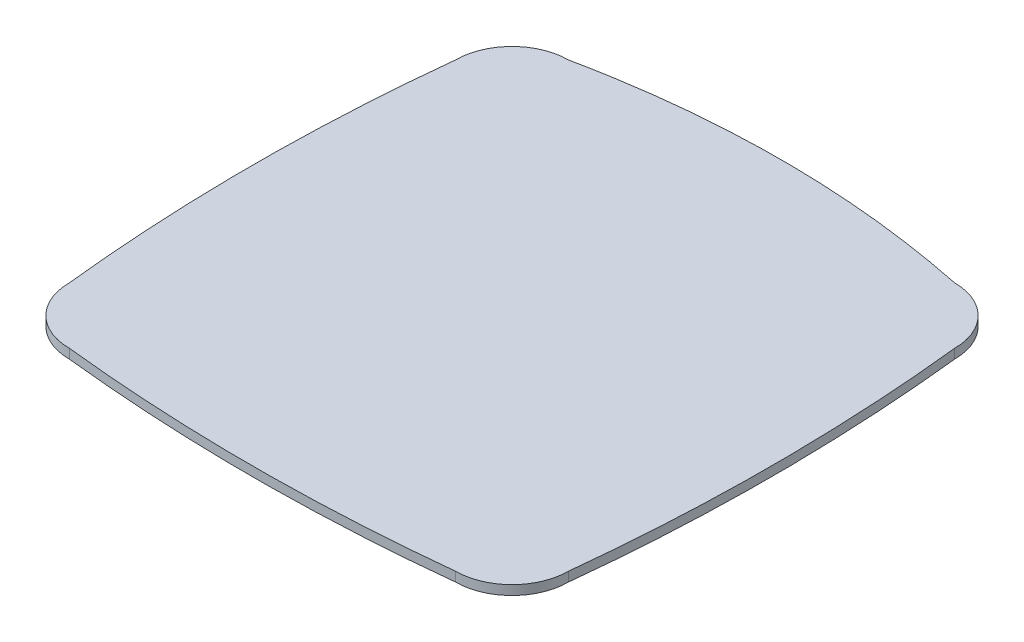
ISO-10303-21;
HEADER;
FILE_DESCRIPTION(('STEP AP214'),'2;1');
FILE_NAME('part.step','',(''),(''),'','','');
FILE_SCHEMA(('AUTOMOTIVE_DESIGN { 1 0 10303 214 1 1 1 1 }'));
ENDSEC;
DATA;
#1=APPLICATION_CONTEXT('core data for automotive mechanical design processes');
#2=APPLICATION_PROTOCOL_DEFINITION('international standard','automotive_design',2000,#1);
#3=PRODUCT_CONTEXT('',#1,'mechanical');
#4=PRODUCT('Part','Part','',(#3));
#5=PRODUCT_RELATED_PRODUCT_CATEGORY('part','',(#4));
#6=PRODUCT_DEFINITION_FORMATION('','',#4);
#7=PRODUCT_DEFINITION_CONTEXT('part definition',#1,'design');
#8=PRODUCT_DEFINITION('design','',#6,#7);
#9=PRODUCT_DEFINITION_SHAPE('','',#8);
#10=(LENGTH_UNIT() NAMED_UNIT(*) SI_UNIT(.MILLI.,.METRE.));
#11=(NAMED_UNIT(*) PLANE_ANGLE_UNIT() SI_UNIT($,.RADIAN.));
#12=(NAMED_UNIT(*) SI_UNIT($,.STERADIAN.) SOLID_ANGLE_UNIT());
#13=UNCERTAINTY_MEASURE_WITH_UNIT(LENGTH_MEASURE(1.E-05),#10,'distance_accuracy_value','');
#14=(GEOMETRIC_REPRESENTATION_CONTEXT(3) GLOBAL_UNCERTAINTY_ASSIGNED_CONTEXT((#13)) GLOBAL_UNIT_ASSIGNED_CONTEXT((#10,
#11,#12)) REPRESENTATION_CONTEXT('',''));
#15=CARTESIAN_POINT('',(0.,0.,0.));
#16=DIRECTION('',(0.,0.,1.));
#17=DIRECTION('',(1.,0.,0.));
#18=AXIS2_PLACEMENT_3D('',#15,#16,#17);
#19=CARTESIAN_POINT('',(26.0349999999999,1.27,-33.655));
#20=CARTESIAN_POINT('',(0.,1.27,-39.0370831545365));
#21=CARTESIAN_POINT('',(-26.0349999999999,1.27,-33.655));
#22=B_SPLINE_CURVE_WITH_KNOTS('',2,(#19,#20,#21),.UNSPECIFIED.,.F.,.F.,(3,3),(0.,1.),.UNSPECIFIED.);
#23=DIRECTION('',(0.,-1.,0.));
#24=VECTOR('',#23,1.);
#25=SURFACE_OF_LINEAR_EXTRUSION('',#22,#24);
#26=CARTESIAN_POINT('',(26.0349999999999,0.,-33.655));
#27=CARTESIAN_POINT('',(0.,0.,-39.0370831545365));
#28=CARTESIAN_POINT('',(-26.0349999999999,0.,-33.655));
#29=B_SPLINE_CURVE_WITH_KNOTS('',2,(#26,#27,#28),.UNSPECIFIED.,.F.,.F.,(3,3),(0.,1.),.UNSPECIFIED.);
#30=CARTESIAN_POINT('',(26.0349999999999,0.,-33.655));
#31=VERTEX_POINT('',#30);
#32=CARTESIAN_POINT('',(-26.0349999999999,0.,-33.655));
#33=VERTEX_POINT('',#32);
#34=EDGE_CURVE('E184',#31,#33,#29,.T.);
#35=ORIENTED_EDGE('',*,*,#34,.T.);
#36=DIRECTION('',(0.,-1.,0.));
#37=VECTOR('',#36,1.);
#38=CARTESIAN_POINT('',(-26.0349999999999,1.27,-33.655));
#39=LINE('',#38,#37);
#40=CARTESIAN_POINT('',(-26.0349999999999,1.27,-33.655));
#41=VERTEX_POINT('',#40);
#42=EDGE_CURVE('E11',#41,#33,#39,.T.);
#43=ORIENTED_EDGE('',*,*,#42,.F.);
#44=CARTESIAN_POINT('',(26.0349999999999,1.27,-33.655));
#45=VERTEX_POINT('',#44);
#46=EDGE_CURVE('E216',#45,#41,#22,.T.);
#47=ORIENTED_EDGE('',*,*,#46,.F.);
#48=DIRECTION('',(0.,-1.,0.));
#49=VECTOR('',#48,1.);
#50=CARTESIAN_POINT('',(26.0349999999999,1.27,-33.655));
#51=LINE('',#50,#49);
#52=EDGE_CURVE('E125',#45,#31,#51,.T.);
#53=ORIENTED_EDGE('',*,*,#52,.T.);
#54=EDGE_LOOP('',(#35,#43,#47,#53));
#55=FACE_BOUND('',#54,.T.);
#56=ADVANCED_FACE('F32',(#55),#25,.F.);
#57=CARTESIAN_POINT('',(-26.035,1.27,-26.035));
#58=DIRECTION('',(0.,-1.,0.));
#59=DIRECTION('',(0.,0.,-1.));
#60=AXIS2_PLACEMENT_3D('',#57,#58,#59);
#61=CYLINDRICAL_SURFACE('',#60,7.62);
#62=CARTESIAN_POINT('',(-26.035,0.,-26.035));
#63=DIRECTION('',(0.,1.,0.));
#64=DIRECTION('',(0.,0.,1.));
#65=AXIS2_PLACEMENT_3D('',#62,#63,#64);
#66=CIRCLE('',#65,7.62);
#67=CARTESIAN_POINT('',(-33.655,0.,-26.0349999999999));
#68=VERTEX_POINT('',#67);
#69=EDGE_CURVE('E175',#33,#68,#66,.T.);
#70=ORIENTED_EDGE('',*,*,#69,.T.);
#71=DIRECTION('',(0.,-1.,0.));
#72=VECTOR('',#71,1.);
#73=CARTESIAN_POINT('',(-33.655,1.27,-26.0349999999999));
#74=LINE('',#73,#72);
#75=CARTESIAN_POINT('',(-33.655,1.27,-26.0349999999999));
#76=VERTEX_POINT('',#75);
#77=EDGE_CURVE('E41',#76,#68,#74,.T.);
#78=ORIENTED_EDGE('',*,*,#77,.F.);
#79=CARTESIAN_POINT('',(-26.035,1.27,-26.035));
#80=DIRECTION('',(0.,1.,0.));
#81=DIRECTION('',(0.,0.,1.));
#82=AXIS2_PLACEMENT_3D('',#79,#80,#81);
#83=CIRCLE('',#82,7.62);
#84=EDGE_CURVE('E92',#41,#76,#83,.T.);
#85=ORIENTED_EDGE('',*,*,#84,.F.);
#86=ORIENTED_EDGE('',*,*,#42,.T.);
#87=EDGE_LOOP('',(#70,#78,#85,#86));
#88=FACE_BOUND('',#87,.T.);
#89=ADVANCED_FACE('F168',(#88),#61,.T.);
#90=CARTESIAN_POINT('',(-33.655,1.27,-26.0349999999999));
#91=CARTESIAN_POINT('',(-36.449,1.27,0.));
#92=CARTESIAN_POINT('',(-33.655,1.27,26.0349999999999));
#93=B_SPLINE_CURVE_WITH_KNOTS('',2,(#90,#91,#92),.UNSPECIFIED.,.F.,.F.,(3,3),(0.,1.),.UNSPECIFIED.);
#94=DIRECTION('',(0.,-1.,0.));
#95=VECTOR('',#94,1.);
#96=SURFACE_OF_LINEAR_EXTRUSION('',#93,#95);
#97=CARTESIAN_POINT('',(-33.655,0.,-26.0349999999999));
#98=CARTESIAN_POINT('',(-36.449,0.,0.));
#99=CARTESIAN_POINT('',(-33.655,0.,26.0349999999999));
#100=B_SPLINE_CURVE_WITH_KNOTS('',2,(#97,#98,#99),.UNSPECIFIED.,.F.,.F.,(3,3),(0.,1.),.UNSPECIFIED.);
#101=CARTESIAN_POINT('',(-33.655,0.,26.0349999999999));
#102=VERTEX_POINT('',#101);
#103=EDGE_CURVE('E183',#68,#102,#100,.T.);
#104=ORIENTED_EDGE('',*,*,#103,.T.);
#105=DIRECTION('',(0.,-1.,0.));
#106=VECTOR('',#105,1.);
#107=CARTESIAN_POINT('',(-33.655,1.27,26.0349999999999));
#108=LINE('',#107,#106);
#109=CARTESIAN_POINT('',(-33.655,1.27,26.0349999999999));
#110=VERTEX_POINT('',#109);
#111=EDGE_CURVE('E188',#110,#102,#108,.T.);
#112=ORIENTED_EDGE('',*,*,#111,.F.);
#113=EDGE_CURVE('E158',#76,#110,#93,.T.);
#114=ORIENTED_EDGE('',*,*,#113,.F.);
#115=ORIENTED_EDGE('',*,*,#77,.T.);
#116=EDGE_LOOP('',(#104,#112,#114,#115));
#117=FACE_BOUND('',#116,.T.);
#118=ADVANCED_FACE('F166',(#117),#96,.F.);
#119=CARTESIAN_POINT('',(-26.035,1.27,26.035));
#120=DIRECTION('',(0.,-1.,0.));
#121=DIRECTION('',(0.,0.,-1.));
#122=AXIS2_PLACEMENT_3D('',#119,#120,#121);
#123=CYLINDRICAL_SURFACE('',#122,7.62);
#124=CARTESIAN_POINT('',(-26.035,0.,26.035));
#125=DIRECTION('',(0.,1.,0.));
#126=DIRECTION('',(0.,0.,-1.));
#127=AXIS2_PLACEMENT_3D('',#124,#125,#126);
#128=CIRCLE('',#127,7.62);
#129=CARTESIAN_POINT('',(-26.0349999999999,0.,33.655));
#130=VERTEX_POINT('',#129);
#131=EDGE_CURVE('E192',#102,#130,#128,.T.);
#132=ORIENTED_EDGE('',*,*,#131,.T.);
#133=DIRECTION('',(0.,-1.,0.));
#134=VECTOR('',#133,1.);
#135=CARTESIAN_POINT('',(-26.0349999999999,1.27,33.655));
#136=LINE('',#135,#134);
#137=CARTESIAN_POINT('',(-26.0349999999999,1.27,33.655));
#138=VERTEX_POINT('',#137);
#139=EDGE_CURVE('E220',#138,#130,#136,.T.);
#140=ORIENTED_EDGE('',*,*,#139,.F.);
#141=CARTESIAN_POINT('',(-26.035,1.27,26.035));
#142=DIRECTION('',(0.,1.,0.));
#143=DIRECTION('',(0.,0.,-1.));
#144=AXIS2_PLACEMENT_3D('',#141,#142,#143);
#145=CIRCLE('',#144,7.62);
#146=EDGE_CURVE('E153',#110,#138,#145,.T.);
#147=ORIENTED_EDGE('',*,*,#146,.F.);
#148=ORIENTED_EDGE('',*,*,#111,.T.);
#149=EDGE_LOOP('',(#132,#140,#147,#148));
#150=FACE_BOUND('',#149,.T.);
#151=ADVANCED_FACE('F146',(#150),#123,.T.);
#152=CARTESIAN_POINT('',(-26.0349999999999,1.27,33.655));
#153=CARTESIAN_POINT('',(0.,1.27,36.449));
#154=CARTESIAN_POINT('',(26.035,1.27,33.655));
#155=B_SPLINE_CURVE_WITH_KNOTS('',2,(#152,#153,#154),.UNSPECIFIED.,.F.,.F.,(3,3),(0.,1.),.UNSPECIFIED.);
#156=DIRECTION('',(0.,-1.,0.));
#157=VECTOR('',#156,1.);
#158=SURFACE_OF_LINEAR_EXTRUSION('',#155,#157);
#159=CARTESIAN_POINT('',(-26.0349999999999,0.,33.655));
#160=CARTESIAN_POINT('',(0.,0.,36.449));
#161=CARTESIAN_POINT('',(26.035,0.,33.655));
#162=B_SPLINE_CURVE_WITH_KNOTS('',2,(#159,#160,#161),.UNSPECIFIED.,.F.,.F.,(3,3),(0.,1.),.UNSPECIFIED.);
#163=CARTESIAN_POINT('',(26.035,0.,33.655));
#164=VERTEX_POINT('',#163);
#165=EDGE_CURVE('E194',#130,#164,#162,.T.);
#166=ORIENTED_EDGE('',*,*,#165,.T.);
#167=DIRECTION('',(0.,-1.,0.));
#168=VECTOR('',#167,1.);
#169=CARTESIAN_POINT('',(26.035,1.27,33.655));
#170=LINE('',#169,#168);
#171=CARTESIAN_POINT('',(26.035,1.27,33.655));
#172=VERTEX_POINT('',#171);
#173=EDGE_CURVE('E120',#172,#164,#170,.T.);
#174=ORIENTED_EDGE('',*,*,#173,.F.);
#175=EDGE_CURVE('E111',#138,#172,#155,.T.);
#176=ORIENTED_EDGE('',*,*,#175,.F.);
#177=ORIENTED_EDGE('',*,*,#139,.T.);
#178=EDGE_LOOP('',(#166,#174,#176,#177));
#179=FACE_BOUND('',#178,.T.);
#180=ADVANCED_FACE('F143',(#179),#158,.F.);
#181=CARTESIAN_POINT('',(26.035,1.27,26.035));
#182=DIRECTION('',(0.,-1.,0.));
#183=DIRECTION('',(0.,0.,-1.));
#184=AXIS2_PLACEMENT_3D('',#181,#182,#183);
#185=CYLINDRICAL_SURFACE('',#184,7.62);
#186=CARTESIAN_POINT('',(26.035,0.,26.035));
#187=DIRECTION('',(0.,1.,0.));
#188=DIRECTION('',(0.,0.,-1.));
#189=AXIS2_PLACEMENT_3D('',#186,#187,#188);
#190=CIRCLE('',#189,7.62);
#191=CARTESIAN_POINT('',(33.655,0.,26.0349999999999));
#192=VERTEX_POINT('',#191);
#193=EDGE_CURVE('E119',#164,#192,#190,.T.);
#194=ORIENTED_EDGE('',*,*,#193,.T.);
#195=DIRECTION('',(0.,-1.,0.));
#196=VECTOR('',#195,1.);
#197=CARTESIAN_POINT('',(33.655,1.27,26.0349999999999));
#198=LINE('',#197,#196);
#199=CARTESIAN_POINT('',(33.655,1.27,26.0349999999999));
#200=VERTEX_POINT('',#199);
#201=EDGE_CURVE('E116',#200,#192,#198,.T.);
#202=ORIENTED_EDGE('',*,*,#201,.F.);
#203=CARTESIAN_POINT('',(26.035,1.27,26.035));
#204=DIRECTION('',(0.,1.,0.));
#205=DIRECTION('',(0.,0.,-1.));
#206=AXIS2_PLACEMENT_3D('',#203,#204,#205);
#207=CIRCLE('',#206,7.62);
#208=EDGE_CURVE('E105',#172,#200,#207,.T.);
#209=ORIENTED_EDGE('',*,*,#208,.F.);
#210=ORIENTED_EDGE('',*,*,#173,.T.);
#211=EDGE_LOOP('',(#194,#202,#209,#210));
#212=FACE_BOUND('',#211,.T.);
#213=ADVANCED_FACE('F117',(#212),#185,.T.);
#214=CARTESIAN_POINT('',(33.655,1.27,26.0349999999999));
#215=CARTESIAN_POINT('',(36.449,1.27,0.));
#216=CARTESIAN_POINT('',(33.655,1.27,-26.035));
#217=B_SPLINE_CURVE_WITH_KNOTS('',2,(#214,#215,#216),.UNSPECIFIED.,.F.,.F.,(3,3),(0.,1.),.UNSPECIFIED.);
#218=DIRECTION('',(0.,-1.,0.));
#219=VECTOR('',#218,1.);
#220=SURFACE_OF_LINEAR_EXTRUSION('',#217,#219);
#221=CARTESIAN_POINT('',(33.655,0.,26.0349999999999));
#222=CARTESIAN_POINT('',(36.449,0.,0.));
#223=CARTESIAN_POINT('',(33.655,0.,-26.035));
#224=B_SPLINE_CURVE_WITH_KNOTS('',2,(#221,#222,#223),.UNSPECIFIED.,.F.,.F.,(3,3),(0.,1.),.UNSPECIFIED.);
#225=CARTESIAN_POINT('',(33.655,0.,-26.035));
#226=VERTEX_POINT('',#225);
#227=EDGE_CURVE('E78',#192,#226,#224,.T.);
#228=ORIENTED_EDGE('',*,*,#227,.T.);
#229=DIRECTION('',(0.,-1.,0.));
#230=VECTOR('',#229,1.);
#231=CARTESIAN_POINT('',(33.655,1.27,-26.035));
#232=LINE('',#231,#230);
#233=CARTESIAN_POINT('',(33.655,1.27,-26.035));
#234=VERTEX_POINT('',#233);
#235=EDGE_CURVE('E121',#234,#226,#232,.T.);
#236=ORIENTED_EDGE('',*,*,#235,.F.);
#237=EDGE_CURVE('E109',#200,#234,#217,.T.);
#238=ORIENTED_EDGE('',*,*,#237,.F.);
#239=ORIENTED_EDGE('',*,*,#201,.T.);
#240=EDGE_LOOP('',(#228,#236,#238,#239));
#241=FACE_BOUND('',#240,.T.);
#242=ADVANCED_FACE('F123',(#241),#220,.F.);
#243=CARTESIAN_POINT('',(26.035,1.27,-26.035));
#244=DIRECTION('',(0.,-1.,0.));
#245=DIRECTION('',(0.,0.,-1.));
#246=AXIS2_PLACEMENT_3D('',#243,#244,#245);
#247=CYLINDRICAL_SURFACE('',#246,7.62);
#248=CARTESIAN_POINT('',(26.035,0.,-26.035));
#249=DIRECTION('',(0.,1.,0.));
#250=DIRECTION('',(0.,0.,-1.));
#251=AXIS2_PLACEMENT_3D('',#248,#249,#250);
#252=CIRCLE('',#251,7.62);
#253=EDGE_CURVE('E84',#226,#31,#252,.T.);
#254=ORIENTED_EDGE('',*,*,#253,.T.);
#255=ORIENTED_EDGE('',*,*,#52,.F.);
#256=CARTESIAN_POINT('',(26.035,1.27,-26.035));
#257=DIRECTION('',(0.,1.,0.));
#258=DIRECTION('',(0.,0.,-1.));
#259=AXIS2_PLACEMENT_3D('',#256,#257,#258);
#260=CIRCLE('',#259,7.62);
#261=EDGE_CURVE('E49',#234,#45,#260,.T.);
#262=ORIENTED_EDGE('',*,*,#261,.F.);
#263=ORIENTED_EDGE('',*,*,#235,.T.);
#264=EDGE_LOOP('',(#254,#255,#262,#263));
#265=FACE_BOUND('',#264,.T.);
#266=ADVANCED_FACE('F139',(#265),#247,.T.);
#267=CARTESIAN_POINT('',(0.,1.27,-36.3460415772683));
#268=DIRECTION('',(0.,1.,0.));
#269=DIRECTION('',(0.,0.,1.));
#270=AXIS2_PLACEMENT_3D('',#267,#268,#269);
#271=PLANE('',#270);
#272=ORIENTED_EDGE('',*,*,#46,.T.);
#273=ORIENTED_EDGE('',*,*,#84,.T.);
#274=ORIENTED_EDGE('',*,*,#113,.T.);
#275=ORIENTED_EDGE('',*,*,#146,.T.);
#276=ORIENTED_EDGE('',*,*,#175,.T.);
#277=ORIENTED_EDGE('',*,*,#208,.T.);
#278=ORIENTED_EDGE('',*,*,#237,.T.);
#279=ORIENTED_EDGE('',*,*,#261,.T.);
#280=EDGE_LOOP('',(#272,#273,#274,#275,#276,#277,#278,#279));
#281=FACE_BOUND('',#280,.T.);
#282=ADVANCED_FACE('F107',(#281),#271,.T.);
#283=CARTESIAN_POINT('',(0.,0.,-36.3460415772683));
#284=DIRECTION('',(0.,1.,0.));
#285=DIRECTION('',(0.,0.,1.));
#286=AXIS2_PLACEMENT_3D('',#283,#284,#285);
#287=PLANE('',#286);
#288=ORIENTED_EDGE('',*,*,#34,.F.);
#289=ORIENTED_EDGE('',*,*,#253,.F.);
#290=ORIENTED_EDGE('',*,*,#227,.F.);
#291=ORIENTED_EDGE('',*,*,#193,.F.);
#292=ORIENTED_EDGE('',*,*,#165,.F.);
#293=ORIENTED_EDGE('',*,*,#131,.F.);
#294=ORIENTED_EDGE('',*,*,#103,.F.);
#295=ORIENTED_EDGE('',*,*,#69,.F.);
#296=EDGE_LOOP('',(#288,#289,#290,#291,#292,#293,#294,#295));
#297=FACE_BOUND('',#296,.T.);
#298=ADVANCED_FACE('F190',(#297),#287,.F.);
#299=CLOSED_SHELL('',(#56,#89,#118,#151,#180,#213,#242,#266,#282,#298));
#300=MANIFOLD_SOLID_BREP('B2',#299);
#301=ADVANCED_BREP_SHAPE_REPRESENTATION('',(#18,#300),#14);
#302=SHAPE_DEFINITION_REPRESENTATION(#9,#301);
ENDSEC;
END-ISO-10303-21;
